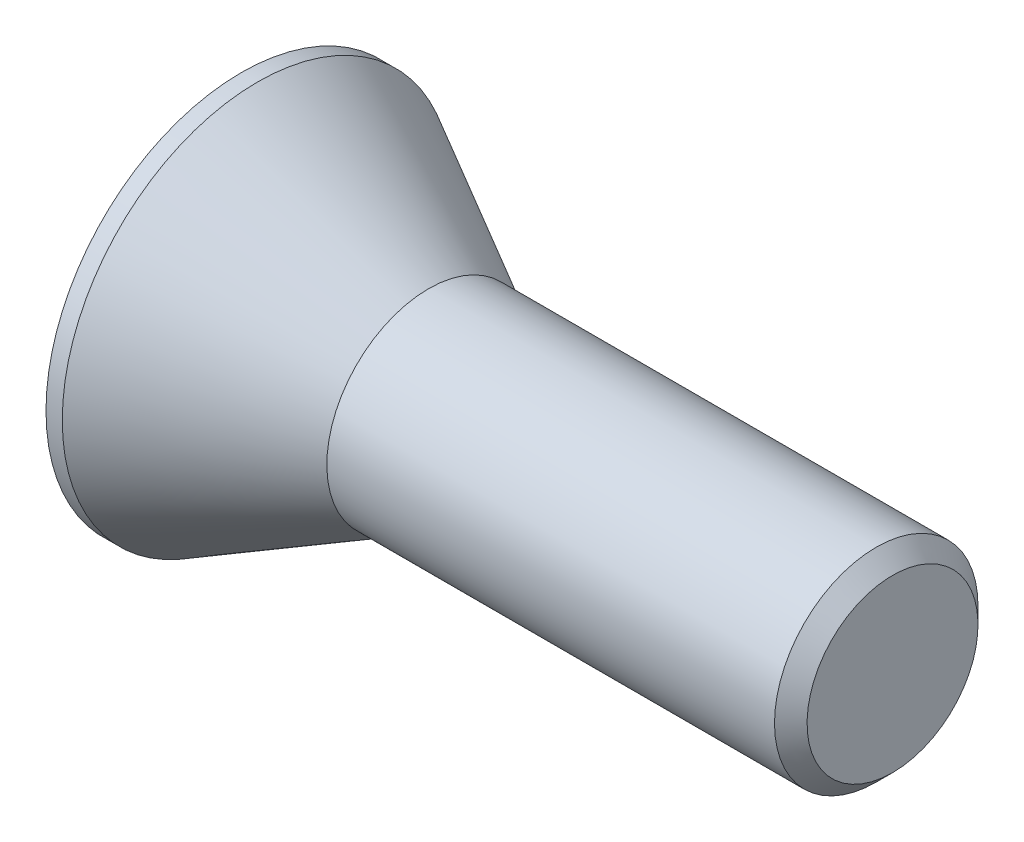
ISO-10303-21;
HEADER;
FILE_DESCRIPTION(('STEP AP214'),'2;1');
FILE_NAME('part.step','',(''),(''),'','','');
FILE_SCHEMA(('AUTOMOTIVE_DESIGN { 1 0 10303 214 1 1 1 1 }'));
ENDSEC;
DATA;
#1=APPLICATION_CONTEXT('core data for automotive mechanical design processes');
#2=APPLICATION_PROTOCOL_DEFINITION('international standard','automotive_design',2000,#1);
#3=PRODUCT_CONTEXT('',#1,'mechanical');
#4=PRODUCT('Part','Part','',(#3));
#5=PRODUCT_RELATED_PRODUCT_CATEGORY('part','',(#4));
#6=PRODUCT_DEFINITION_FORMATION('','',#4);
#7=PRODUCT_DEFINITION_CONTEXT('part definition',#1,'design');
#8=PRODUCT_DEFINITION('design','',#6,#7);
#9=PRODUCT_DEFINITION_SHAPE('','',#8);
#10=(LENGTH_UNIT() NAMED_UNIT(*) SI_UNIT(.MILLI.,.METRE.));
#11=(NAMED_UNIT(*) PLANE_ANGLE_UNIT() SI_UNIT($,.RADIAN.));
#12=(NAMED_UNIT(*) SI_UNIT($,.STERADIAN.) SOLID_ANGLE_UNIT());
#13=UNCERTAINTY_MEASURE_WITH_UNIT(LENGTH_MEASURE(1.E-05),#10,'distance_accuracy_value','');
#14=(GEOMETRIC_REPRESENTATION_CONTEXT(3) GLOBAL_UNCERTAINTY_ASSIGNED_CONTEXT((#13)) GLOBAL_UNIT_ASSIGNED_CONTEXT((#10,
#11,#12)) REPRESENTATION_CONTEXT('',''));
#15=CARTESIAN_POINT('',(0.,0.,0.));
#16=DIRECTION('',(0.,0.,1.));
#17=DIRECTION('',(1.,0.,0.));
#18=AXIS2_PLACEMENT_3D('',#15,#16,#17);
#19=CARTESIAN_POINT('',(0.,0.,0.));
#20=DIRECTION('',(1.,0.,0.));
#21=DIRECTION('',(0.,1.,0.));
#22=AXIS2_PLACEMENT_3D('',#19,#20,#21);
#23=PLANE('',#22);
#24=DIRECTION('',(0.,0.866025403784439,-0.5));
#25=VECTOR('',#24,1.);
#26=CARTESIAN_POINT('',(0.,0.,0.866025403784439));
#27=LINE('',#26,#25);
#28=CARTESIAN_POINT('',(0.,0.,0.866025403784439));
#29=VERTEX_POINT('',#28);
#30=CARTESIAN_POINT('',(0.,0.75,0.433012701892219));
#31=VERTEX_POINT('',#30);
#32=EDGE_CURVE('E144',#29,#31,#27,.T.);
#33=ORIENTED_EDGE('',*,*,#32,.F.);
#34=DIRECTION('',(0.,0.866025403784439,0.5));
#35=VECTOR('',#34,1.);
#36=CARTESIAN_POINT('',(0.,-0.75,0.43301270189222));
#37=LINE('',#36,#35);
#38=CARTESIAN_POINT('',(0.,-0.75,0.43301270189222));
#39=VERTEX_POINT('',#38);
#40=EDGE_CURVE('E64',#39,#29,#37,.T.);
#41=ORIENTED_EDGE('',*,*,#40,.F.);
#42=DIRECTION('',(0.,0.,1.));
#43=VECTOR('',#42,1.);
#44=CARTESIAN_POINT('',(0.,-0.75,-0.433012701892219));
#45=LINE('',#44,#43);
#46=CARTESIAN_POINT('',(0.,-0.75,-0.433012701892219));
#47=VERTEX_POINT('',#46);
#48=EDGE_CURVE('E157',#47,#39,#45,.T.);
#49=ORIENTED_EDGE('',*,*,#48,.F.);
#50=DIRECTION('',(0.,-0.866025403784438,0.5));
#51=VECTOR('',#50,1.);
#52=CARTESIAN_POINT('',(0.,0.,-0.866025403784439));
#53=LINE('',#52,#51);
#54=CARTESIAN_POINT('',(0.,0.,-0.866025403784439));
#55=VERTEX_POINT('',#54);
#56=EDGE_CURVE('E154',#55,#47,#53,.T.);
#57=ORIENTED_EDGE('',*,*,#56,.F.);
#58=DIRECTION('',(0.,-0.866025403784439,-0.5));
#59=VECTOR('',#58,1.);
#60=CARTESIAN_POINT('',(0.,0.75,-0.433012701892219));
#61=LINE('',#60,#59);
#62=CARTESIAN_POINT('',(0.,0.75,-0.433012701892219));
#63=VERTEX_POINT('',#62);
#64=EDGE_CURVE('E112',#63,#55,#61,.T.);
#65=ORIENTED_EDGE('',*,*,#64,.F.);
#66=DIRECTION('',(0.,0.,-1.));
#67=VECTOR('',#66,1.);
#68=CARTESIAN_POINT('',(0.,0.75,0.433012701892219));
#69=LINE('',#68,#67);
#70=EDGE_CURVE('E148',#31,#63,#69,.T.);
#71=ORIENTED_EDGE('',*,*,#70,.F.);
#72=EDGE_LOOP('',(#33,#41,#49,#57,#65,#71));
#73=FACE_BOUND('',#72,.T.);
#74=CARTESIAN_POINT('',(0.,0.,0.));
#75=DIRECTION('',(1.,0.,0.));
#76=DIRECTION('',(0.,1.,0.));
#77=AXIS2_PLACEMENT_3D('',#74,#75,#76);
#78=CIRCLE('',#77,2.4);
#79=CARTESIAN_POINT('',(0.,2.4,0.));
#80=VERTEX_POINT('',#79);
#81=EDGE_CURVE('E180',#80,#80,#78,.T.);
#82=ORIENTED_EDGE('',*,*,#81,.F.);
#83=EDGE_LOOP('',(#82));
#84=FACE_BOUND('',#83,.T.);
#85=ADVANCED_FACE('F47',(#73,#84),#23,.F.);
#86=CARTESIAN_POINT('',(8.,0.,0.));
#87=DIRECTION('',(1.,0.,0.));
#88=DIRECTION('',(0.,1.,0.));
#89=AXIS2_PLACEMENT_3D('',#86,#87,#88);
#90=CYLINDRICAL_SURFACE('',#89,2.4);
#91=CARTESIAN_POINT('',(0.200000000000001,0.,0.));
#92=DIRECTION('',(1.,0.,0.));
#93=DIRECTION('',(0.,1.,0.));
#94=AXIS2_PLACEMENT_3D('',#91,#92,#93);
#95=CIRCLE('',#94,2.4);
#96=CARTESIAN_POINT('',(0.200000000000001,2.4,0.));
#97=VERTEX_POINT('',#96);
#98=EDGE_CURVE('E176',#97,#97,#95,.T.);
#99=ORIENTED_EDGE('',*,*,#98,.F.);
#100=EDGE_LOOP('',(#99));
#101=FACE_BOUND('',#100,.T.);
#102=ORIENTED_EDGE('',*,*,#81,.T.);
#103=EDGE_LOOP('',(#102));
#104=FACE_BOUND('',#103,.T.);
#105=ADVANCED_FACE('F199',(#101,#104),#90,.T.);
#106=CARTESIAN_POINT('',(0.200000000000001,0.,0.));
#107=DIRECTION('',(-1.,0.,0.));
#108=DIRECTION('',(0.,-1.,0.));
#109=AXIS2_PLACEMENT_3D('',#106,#107,#108);
#110=CONICAL_SURFACE('',#109,2.4,0.50101338680359);
#111=CARTESIAN_POINT('',(2.3,0.,0.));
#112=DIRECTION('',(1.,0.,0.));
#113=DIRECTION('',(0.,1.,0.));
#114=AXIS2_PLACEMENT_3D('',#111,#112,#113);
#115=CIRCLE('',#114,1.25);
#116=CARTESIAN_POINT('',(2.3,1.25,0.));
#117=VERTEX_POINT('',#116);
#118=EDGE_CURVE('E163',#117,#117,#115,.T.);
#119=ORIENTED_EDGE('',*,*,#118,.F.);
#120=EDGE_LOOP('',(#119));
#121=FACE_BOUND('',#120,.T.);
#122=ORIENTED_EDGE('',*,*,#98,.T.);
#123=EDGE_LOOP('',(#122));
#124=FACE_BOUND('',#123,.T.);
#125=ADVANCED_FACE('F206',(#121,#124),#110,.T.);
#126=CARTESIAN_POINT('',(8.,0.,0.));
#127=DIRECTION('',(1.,0.,0.));
#128=DIRECTION('',(0.,1.,0.));
#129=AXIS2_PLACEMENT_3D('',#126,#127,#128);
#130=CYLINDRICAL_SURFACE('',#129,1.25);
#131=CARTESIAN_POINT('',(7.8,0.,0.));
#132=DIRECTION('',(-1.,0.,0.));
#133=DIRECTION('',(0.,-1.,0.));
#134=AXIS2_PLACEMENT_3D('',#131,#132,#133);
#135=CIRCLE('',#134,1.25);
#136=CARTESIAN_POINT('',(7.8,-1.25,0.));
#137=VERTEX_POINT('',#136);
#138=EDGE_CURVE('E11',#137,#137,#135,.T.);
#139=ORIENTED_EDGE('',*,*,#138,.T.);
#140=EDGE_LOOP('',(#139));
#141=FACE_BOUND('',#140,.T.);
#142=ORIENTED_EDGE('',*,*,#118,.T.);
#143=EDGE_LOOP('',(#142));
#144=FACE_BOUND('',#143,.T.);
#145=ADVANCED_FACE('F213',(#141,#144),#130,.T.);
#146=CARTESIAN_POINT('',(8.,-1.25,0.));
#147=DIRECTION('',(-1.,0.,0.));
#148=DIRECTION('',(0.,-1.,0.));
#149=AXIS2_PLACEMENT_3D('',#146,#147,#148);
#150=PLANE('',#149);
#151=CARTESIAN_POINT('',(8.,0.,0.));
#152=DIRECTION('',(-1.,0.,0.));
#153=DIRECTION('',(0.,-1.,0.));
#154=AXIS2_PLACEMENT_3D('',#151,#152,#153);
#155=CIRCLE('',#154,1.05);
#156=CARTESIAN_POINT('',(8.,-1.05,0.));
#157=VERTEX_POINT('',#156);
#158=EDGE_CURVE('E57',#157,#157,#155,.F.);
#159=ORIENTED_EDGE('',*,*,#158,.T.);
#160=EDGE_LOOP('',(#159));
#161=FACE_BOUND('',#160,.T.);
#162=ADVANCED_FACE('F187',(#161),#150,.F.);
#163=CARTESIAN_POINT('',(0.4,-0.75,0.43301270189222));
#164=DIRECTION('',(0.,-0.5,0.866025403784439));
#165=DIRECTION('',(0.,-0.866025403784439,-0.5));
#166=AXIS2_PLACEMENT_3D('',#163,#164,#165);
#167=PLANE('',#166);
#168=ORIENTED_EDGE('',*,*,#40,.T.);
#169=DIRECTION('',(-1.,0.,0.));
#170=VECTOR('',#169,1.);
#171=CARTESIAN_POINT('',(0.4,0.,0.866025403784439));
#172=LINE('',#171,#170);
#173=CARTESIAN_POINT('',(0.4,0.,0.866025403784439));
#174=VERTEX_POINT('',#173);
#175=EDGE_CURVE('E94',#174,#29,#172,.T.);
#176=ORIENTED_EDGE('',*,*,#175,.F.);
#177=DIRECTION('',(0.,0.866025403784439,0.5));
#178=VECTOR('',#177,1.);
#179=CARTESIAN_POINT('',(0.4,-0.75,0.43301270189222));
#180=LINE('',#179,#178);
#181=CARTESIAN_POINT('',(0.4,-0.75,0.43301270189222));
#182=VERTEX_POINT('',#181);
#183=EDGE_CURVE('E160',#182,#174,#180,.T.);
#184=ORIENTED_EDGE('',*,*,#183,.F.);
#185=DIRECTION('',(-1.,0.,0.));
#186=VECTOR('',#185,1.);
#187=CARTESIAN_POINT('',(0.4,-0.75,0.43301270189222));
#188=LINE('',#187,#186);
#189=EDGE_CURVE('E72',#182,#39,#188,.T.);
#190=ORIENTED_EDGE('',*,*,#189,.T.);
#191=EDGE_LOOP('',(#168,#176,#184,#190));
#192=FACE_BOUND('',#191,.T.);
#193=ADVANCED_FACE('F219',(#192),#167,.F.);
#194=CARTESIAN_POINT('',(0.4,-0.75,-0.433012701892219));
#195=DIRECTION('',(0.,-1.,0.));
#196=DIRECTION('',(1.,0.,0.));
#197=AXIS2_PLACEMENT_3D('',#194,#195,#196);
#198=PLANE('',#197);
#199=ORIENTED_EDGE('',*,*,#48,.T.);
#200=ORIENTED_EDGE('',*,*,#189,.F.);
#201=DIRECTION('',(0.,0.,1.));
#202=VECTOR('',#201,1.);
#203=CARTESIAN_POINT('',(0.4,-0.75,-0.433012701892219));
#204=LINE('',#203,#202);
#205=CARTESIAN_POINT('',(0.4,-0.75,-0.433012701892219));
#206=VERTEX_POINT('',#205);
#207=EDGE_CURVE('E126',#206,#182,#204,.T.);
#208=ORIENTED_EDGE('',*,*,#207,.F.);
#209=DIRECTION('',(-1.,0.,0.));
#210=VECTOR('',#209,1.);
#211=CARTESIAN_POINT('',(0.4,-0.75,-0.433012701892219));
#212=LINE('',#211,#210);
#213=EDGE_CURVE('E117',#206,#47,#212,.T.);
#214=ORIENTED_EDGE('',*,*,#213,.T.);
#215=EDGE_LOOP('',(#199,#200,#208,#214));
#216=FACE_BOUND('',#215,.T.);
#217=ADVANCED_FACE('F221',(#216),#198,.F.);
#218=CARTESIAN_POINT('',(0.4,0.,-0.866025403784439));
#219=DIRECTION('',(0.,-0.5,-0.866025403784438));
#220=DIRECTION('',(0.,0.866025403784438,-0.5));
#221=AXIS2_PLACEMENT_3D('',#218,#219,#220);
#222=PLANE('',#221);
#223=ORIENTED_EDGE('',*,*,#56,.T.);
#224=ORIENTED_EDGE('',*,*,#213,.F.);
#225=DIRECTION('',(0.,-0.866025403784438,0.5));
#226=VECTOR('',#225,1.);
#227=CARTESIAN_POINT('',(0.4,0.,-0.866025403784439));
#228=LINE('',#227,#226);
#229=CARTESIAN_POINT('',(0.4,0.,-0.866025403784439));
#230=VERTEX_POINT('',#229);
#231=EDGE_CURVE('E121',#230,#206,#228,.T.);
#232=ORIENTED_EDGE('',*,*,#231,.F.);
#233=DIRECTION('',(-1.,0.,0.));
#234=VECTOR('',#233,1.);
#235=CARTESIAN_POINT('',(0.4,0.,-0.866025403784439));
#236=LINE('',#235,#234);
#237=EDGE_CURVE('E105',#230,#55,#236,.T.);
#238=ORIENTED_EDGE('',*,*,#237,.T.);
#239=EDGE_LOOP('',(#223,#224,#232,#238));
#240=FACE_BOUND('',#239,.T.);
#241=ADVANCED_FACE('F122',(#240),#222,.F.);
#242=CARTESIAN_POINT('',(0.4,0.75,-0.433012701892219));
#243=DIRECTION('',(0.,0.5,-0.866025403784439));
#244=DIRECTION('',(0.,0.866025403784439,0.5));
#245=AXIS2_PLACEMENT_3D('',#242,#243,#244);
#246=PLANE('',#245);
#247=ORIENTED_EDGE('',*,*,#64,.T.);
#248=ORIENTED_EDGE('',*,*,#237,.F.);
#249=DIRECTION('',(0.,-0.866025403784439,-0.5));
#250=VECTOR('',#249,1.);
#251=CARTESIAN_POINT('',(0.4,0.75,-0.433012701892219));
#252=LINE('',#251,#250);
#253=CARTESIAN_POINT('',(0.4,0.75,-0.433012701892219));
#254=VERTEX_POINT('',#253);
#255=EDGE_CURVE('E109',#254,#230,#252,.T.);
#256=ORIENTED_EDGE('',*,*,#255,.F.);
#257=DIRECTION('',(-1.,0.,0.));
#258=VECTOR('',#257,1.);
#259=CARTESIAN_POINT('',(0.4,0.75,-0.433012701892219));
#260=LINE('',#259,#258);
#261=EDGE_CURVE('E118',#254,#63,#260,.T.);
#262=ORIENTED_EDGE('',*,*,#261,.T.);
#263=EDGE_LOOP('',(#247,#248,#256,#262));
#264=FACE_BOUND('',#263,.T.);
#265=ADVANCED_FACE('F107',(#264),#246,.F.);
#266=CARTESIAN_POINT('',(0.4,0.75,0.433012701892219));
#267=DIRECTION('',(0.,1.,0.));
#268=DIRECTION('',(-1.,0.,0.));
#269=AXIS2_PLACEMENT_3D('',#266,#267,#268);
#270=PLANE('',#269);
#271=ORIENTED_EDGE('',*,*,#70,.T.);
#272=ORIENTED_EDGE('',*,*,#261,.F.);
#273=DIRECTION('',(0.,0.,-1.));
#274=VECTOR('',#273,1.);
#275=CARTESIAN_POINT('',(0.4,0.75,0.433012701892219));
#276=LINE('',#275,#274);
#277=CARTESIAN_POINT('',(0.4,0.75,0.433012701892219));
#278=VERTEX_POINT('',#277);
#279=EDGE_CURVE('E132',#278,#254,#276,.T.);
#280=ORIENTED_EDGE('',*,*,#279,.F.);
#281=DIRECTION('',(-1.,0.,0.));
#282=VECTOR('',#281,1.);
#283=CARTESIAN_POINT('',(0.4,0.75,0.433012701892219));
#284=LINE('',#283,#282);
#285=EDGE_CURVE('E168',#278,#31,#284,.T.);
#286=ORIENTED_EDGE('',*,*,#285,.T.);
#287=EDGE_LOOP('',(#271,#272,#280,#286));
#288=FACE_BOUND('',#287,.T.);
#289=ADVANCED_FACE('F224',(#288),#270,.F.);
#290=CARTESIAN_POINT('',(0.4,0.,0.866025403784439));
#291=DIRECTION('',(0.,0.5,0.866025403784438));
#292=DIRECTION('',(0.,-0.866025403784439,0.5));
#293=AXIS2_PLACEMENT_3D('',#290,#291,#292);
#294=PLANE('',#293);
#295=ORIENTED_EDGE('',*,*,#32,.T.);
#296=ORIENTED_EDGE('',*,*,#285,.F.);
#297=DIRECTION('',(0.,0.866025403784439,-0.5));
#298=VECTOR('',#297,1.);
#299=CARTESIAN_POINT('',(0.4,0.,0.866025403784439));
#300=LINE('',#299,#298);
#301=EDGE_CURVE('E136',#174,#278,#300,.T.);
#302=ORIENTED_EDGE('',*,*,#301,.F.);
#303=ORIENTED_EDGE('',*,*,#175,.T.);
#304=EDGE_LOOP('',(#295,#296,#302,#303));
#305=FACE_BOUND('',#304,.T.);
#306=ADVANCED_FACE('F195',(#305),#294,.F.);
#307=CARTESIAN_POINT('',(0.4,0.,0.));
#308=DIRECTION('',(-1.,0.,0.));
#309=DIRECTION('',(0.,-1.,0.));
#310=AXIS2_PLACEMENT_3D('',#307,#308,#309);
#311=PLANE('',#310);
#312=ORIENTED_EDGE('',*,*,#183,.T.);
#313=ORIENTED_EDGE('',*,*,#301,.T.);
#314=ORIENTED_EDGE('',*,*,#279,.T.);
#315=ORIENTED_EDGE('',*,*,#255,.T.);
#316=ORIENTED_EDGE('',*,*,#231,.T.);
#317=ORIENTED_EDGE('',*,*,#207,.T.);
#318=EDGE_LOOP('',(#312,#313,#314,#315,#316,#317));
#319=FACE_BOUND('',#318,.T.);
#320=ADVANCED_FACE('F129',(#319),#311,.T.);
#321=CARTESIAN_POINT('',(8.,0.,0.));
#322=DIRECTION('',(-1.,0.,0.));
#323=DIRECTION('',(0.,-1.,0.));
#324=AXIS2_PLACEMENT_3D('',#321,#322,#323);
#325=CONICAL_SURFACE('',#324,1.05,0.785398163397447);
#326=ORIENTED_EDGE('',*,*,#138,.F.);
#327=EDGE_LOOP('',(#326));
#328=FACE_BOUND('',#327,.T.);
#329=ORIENTED_EDGE('',*,*,#158,.F.);
#330=EDGE_LOOP('',(#329));
#331=FACE_BOUND('',#330,.T.);
#332=ADVANCED_FACE('F50',(#328,#331),#325,.T.);
#333=CLOSED_SHELL('',(#85,#105,#125,#145,#162,#193,#217,#241,#265,#289,#306,#320,#332));
#334=MANIFOLD_SOLID_BREP('B2',#333);
#335=ADVANCED_BREP_SHAPE_REPRESENTATION('',(#18,#334),#14);
#336=SHAPE_DEFINITION_REPRESENTATION(#9,#335);
ENDSEC;
END-ISO-10303-21;
